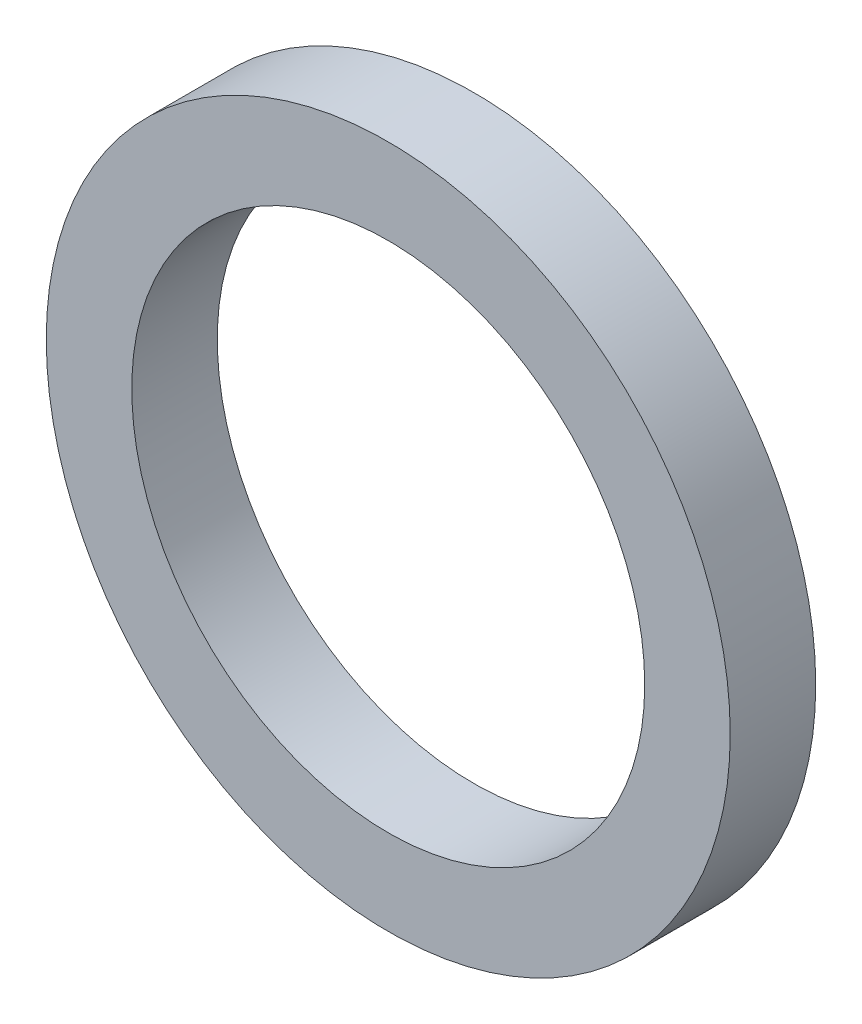
ISO-10303-21;
HEADER;
FILE_DESCRIPTION(('STEP AP214'),'2;1');
FILE_NAME('part.step','',(''),(''),'','','');
FILE_SCHEMA(('AUTOMOTIVE_DESIGN { 1 0 10303 214 1 1 1 1 }'));
ENDSEC;
DATA;
#1=APPLICATION_CONTEXT('core data for automotive mechanical design processes');
#2=APPLICATION_PROTOCOL_DEFINITION('international standard','automotive_design',2000,#1);
#3=PRODUCT_CONTEXT('',#1,'mechanical');
#4=PRODUCT('Part','Part','',(#3));
#5=PRODUCT_RELATED_PRODUCT_CATEGORY('part','',(#4));
#6=PRODUCT_DEFINITION_FORMATION('','',#4);
#7=PRODUCT_DEFINITION_CONTEXT('part definition',#1,'design');
#8=PRODUCT_DEFINITION('design','',#6,#7);
#9=PRODUCT_DEFINITION_SHAPE('','',#8);
#10=(LENGTH_UNIT() NAMED_UNIT(*) SI_UNIT(.MILLI.,.METRE.));
#11=(NAMED_UNIT(*) PLANE_ANGLE_UNIT() SI_UNIT($,.RADIAN.));
#12=(NAMED_UNIT(*) SI_UNIT($,.STERADIAN.) SOLID_ANGLE_UNIT());
#13=UNCERTAINTY_MEASURE_WITH_UNIT(LENGTH_MEASURE(1.E-05),#10,'distance_accuracy_value','');
#14=(GEOMETRIC_REPRESENTATION_CONTEXT(3) GLOBAL_UNCERTAINTY_ASSIGNED_CONTEXT((#13)) GLOBAL_UNIT_ASSIGNED_CONTEXT((#10,
#11,#12)) REPRESENTATION_CONTEXT('',''));
#15=CARTESIAN_POINT('',(0.,0.,0.));
#16=DIRECTION('',(0.,0.,1.));
#17=DIRECTION('',(1.,0.,0.));
#18=AXIS2_PLACEMENT_3D('',#15,#16,#17);
#19=CARTESIAN_POINT('',(0.,0.,6.35));
#20=DIRECTION('',(0.,0.,1.));
#21=DIRECTION('',(1.,0.,0.));
#22=AXIS2_PLACEMENT_3D('',#19,#20,#21);
#23=PLANE('',#22);
#24=CARTESIAN_POINT('',(0.,0.,6.35));
#25=DIRECTION('',(0.,0.,1.));
#26=DIRECTION('',(1.,0.,0.));
#27=AXIS2_PLACEMENT_3D('',#24,#25,#26);
#28=CIRCLE('',#27,50.8);
#29=CARTESIAN_POINT('',(50.8,0.,6.35));
#30=VERTEX_POINT('',#29);
#31=EDGE_CURVE('E10',#30,#30,#28,.T.);
#32=ORIENTED_EDGE('',*,*,#31,.T.);
#33=EDGE_LOOP('',(#32));
#34=FACE_BOUND('',#33,.T.);
#35=CARTESIAN_POINT('',(0.,0.,6.35));
#36=DIRECTION('',(0.,0.,1.));
#37=DIRECTION('',(1.,0.,0.));
#38=AXIS2_PLACEMENT_3D('',#35,#36,#37);
#39=CIRCLE('',#38,38.1);
#40=CARTESIAN_POINT('',(38.1,0.,6.35));
#41=VERTEX_POINT('',#40);
#42=EDGE_CURVE('E46',#41,#41,#39,.T.);
#43=ORIENTED_EDGE('',*,*,#42,.F.);
#44=EDGE_LOOP('',(#43));
#45=FACE_BOUND('',#44,.T.);
#46=ADVANCED_FACE('F35',(#34,#45),#23,.T.);
#47=CARTESIAN_POINT('',(0.,0.,-6.35));
#48=DIRECTION('',(0.,0.,1.));
#49=DIRECTION('',(1.,0.,0.));
#50=AXIS2_PLACEMENT_3D('',#47,#48,#49);
#51=PLANE('',#50);
#52=CARTESIAN_POINT('',(0.,0.,-6.35));
#53=DIRECTION('',(0.,0.,1.));
#54=DIRECTION('',(1.,0.,0.));
#55=AXIS2_PLACEMENT_3D('',#52,#53,#54);
#56=CIRCLE('',#55,50.8);
#57=CARTESIAN_POINT('',(50.8,0.,-6.35));
#58=VERTEX_POINT('',#57);
#59=EDGE_CURVE('E39',#58,#58,#56,.T.);
#60=ORIENTED_EDGE('',*,*,#59,.F.);
#61=EDGE_LOOP('',(#60));
#62=FACE_BOUND('',#61,.T.);
#63=CARTESIAN_POINT('',(0.,0.,-6.35));
#64=DIRECTION('',(0.,0.,1.));
#65=DIRECTION('',(1.,0.,0.));
#66=AXIS2_PLACEMENT_3D('',#63,#64,#65);
#67=CIRCLE('',#66,38.1);
#68=CARTESIAN_POINT('',(38.1,0.,-6.35));
#69=VERTEX_POINT('',#68);
#70=EDGE_CURVE('E48',#69,#69,#67,.T.);
#71=ORIENTED_EDGE('',*,*,#70,.T.);
#72=EDGE_LOOP('',(#71));
#73=FACE_BOUND('',#72,.T.);
#74=ADVANCED_FACE('F58',(#62,#73),#51,.F.);
#75=CARTESIAN_POINT('',(0.,0.,6.35));
#76=DIRECTION('',(0.,0.,-1.));
#77=DIRECTION('',(-1.,0.,0.));
#78=AXIS2_PLACEMENT_3D('',#75,#76,#77);
#79=CYLINDRICAL_SURFACE('',#78,50.8);
#80=ORIENTED_EDGE('',*,*,#31,.F.);
#81=EDGE_LOOP('',(#80));
#82=FACE_BOUND('',#81,.T.);
#83=ORIENTED_EDGE('',*,*,#59,.T.);
#84=EDGE_LOOP('',(#83));
#85=FACE_BOUND('',#84,.T.);
#86=ADVANCED_FACE('F37',(#82,#85),#79,.T.);
#87=CARTESIAN_POINT('',(0.,0.,6.35));
#88=DIRECTION('',(0.,0.,-1.));
#89=DIRECTION('',(-1.,0.,0.));
#90=AXIS2_PLACEMENT_3D('',#87,#88,#89);
#91=CYLINDRICAL_SURFACE('',#90,38.1);
#92=ORIENTED_EDGE('',*,*,#42,.T.);
#93=EDGE_LOOP('',(#92));
#94=FACE_BOUND('',#93,.T.);
#95=ORIENTED_EDGE('',*,*,#70,.F.);
#96=EDGE_LOOP('',(#95));
#97=FACE_BOUND('',#96,.T.);
#98=ADVANCED_FACE('F54',(#94,#97),#91,.F.);
#99=CLOSED_SHELL('',(#46,#74,#86,#98));
#100=MANIFOLD_SOLID_BREP('B2',#99);
#101=ADVANCED_BREP_SHAPE_REPRESENTATION('',(#18,#100),#14);
#102=SHAPE_DEFINITION_REPRESENTATION(#9,#101);
ENDSEC;
END-ISO-10303-21;
